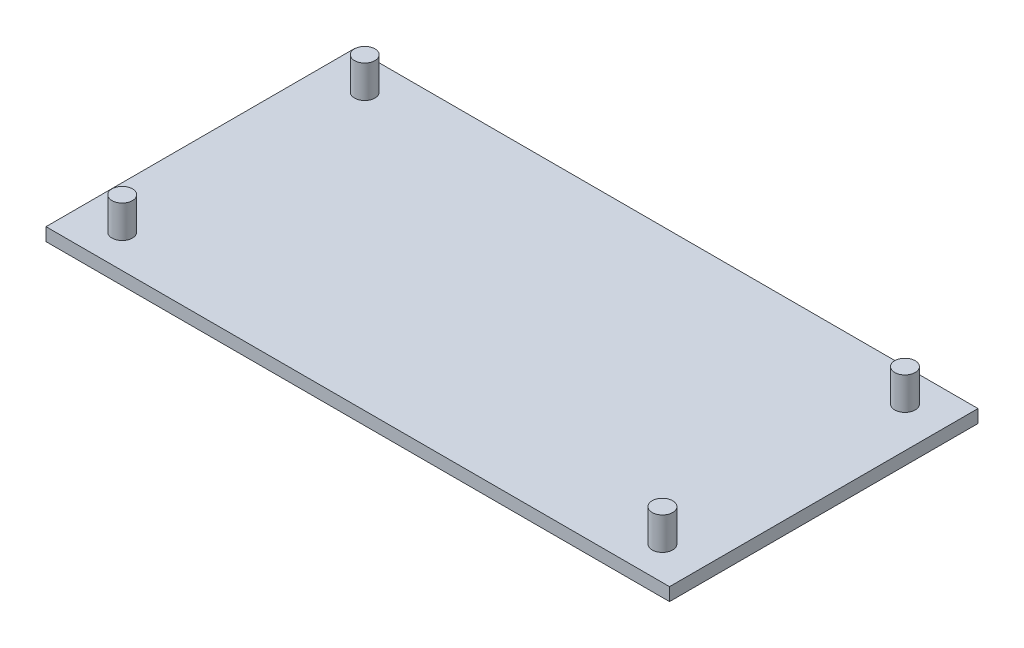
ISO-10303-21;
HEADER;
FILE_DESCRIPTION(('STEP AP214'),'2;1');
FILE_NAME('part.step','',(''),(''),'','','');
FILE_SCHEMA(('AUTOMOTIVE_DESIGN { 1 0 10303 214 1 1 1 1 }'));
ENDSEC;
DATA;
#1=APPLICATION_CONTEXT('core data for automotive mechanical design processes');
#2=APPLICATION_PROTOCOL_DEFINITION('international standard','automotive_design',2000,#1);
#3=PRODUCT_CONTEXT('',#1,'mechanical');
#4=PRODUCT('Part','Part','',(#3));
#5=PRODUCT_RELATED_PRODUCT_CATEGORY('part','',(#4));
#6=PRODUCT_DEFINITION_FORMATION('','',#4);
#7=PRODUCT_DEFINITION_CONTEXT('part definition',#1,'design');
#8=PRODUCT_DEFINITION('design','',#6,#7);
#9=PRODUCT_DEFINITION_SHAPE('','',#8);
#10=(LENGTH_UNIT() NAMED_UNIT(*) SI_UNIT(.MILLI.,.METRE.));
#11=(NAMED_UNIT(*) PLANE_ANGLE_UNIT() SI_UNIT($,.RADIAN.));
#12=(NAMED_UNIT(*) SI_UNIT($,.STERADIAN.) SOLID_ANGLE_UNIT());
#13=UNCERTAINTY_MEASURE_WITH_UNIT(LENGTH_MEASURE(1.E-05),#10,'distance_accuracy_value','');
#14=(GEOMETRIC_REPRESENTATION_CONTEXT(3) GLOBAL_UNCERTAINTY_ASSIGNED_CONTEXT((#13)) GLOBAL_UNIT_ASSIGNED_CONTEXT((#10,
#11,#12)) REPRESENTATION_CONTEXT('',''));
#15=CARTESIAN_POINT('',(0.,0.,0.));
#16=DIRECTION('',(0.,0.,1.));
#17=DIRECTION('',(1.,0.,0.));
#18=AXIS2_PLACEMENT_3D('',#15,#16,#17);
#19=CARTESIAN_POINT('',(45.8784400663104,2.,23.6626394547951));
#20=DIRECTION('',(0.,0.,1.));
#21=DIRECTION('',(1.,0.,0.));
#22=AXIS2_PLACEMENT_3D('',#19,#20,#21);
#23=PLANE('',#22);
#24=DIRECTION('',(-1.,0.,0.));
#25=VECTOR('',#24,1.);
#26=CARTESIAN_POINT('',(45.8784400663104,0.,23.6626394547951));
#27=LINE('',#26,#25);
#28=CARTESIAN_POINT('',(45.8784400663104,0.,23.6626394547951));
#29=VERTEX_POINT('',#28);
#30=CARTESIAN_POINT('',(-50.1505239347028,0.,23.6626394547951));
#31=VERTEX_POINT('',#30);
#32=EDGE_CURVE('E119',#29,#31,#27,.T.);
#33=ORIENTED_EDGE('',*,*,#32,.F.);
#34=DIRECTION('',(0.,-1.,0.));
#35=VECTOR('',#34,1.);
#36=CARTESIAN_POINT('',(45.8784400663104,2.,23.6626394547951));
#37=LINE('',#36,#35);
#38=CARTESIAN_POINT('',(45.8784400663104,2.,23.6626394547951));
#39=VERTEX_POINT('',#38);
#40=EDGE_CURVE('E62',#39,#29,#37,.T.);
#41=ORIENTED_EDGE('',*,*,#40,.F.);
#42=DIRECTION('',(-1.,0.,0.));
#43=VECTOR('',#42,1.);
#44=CARTESIAN_POINT('',(45.8784400663104,2.,23.6626394547951));
#45=LINE('',#44,#43);
#46=CARTESIAN_POINT('',(-50.1505239347028,2.,23.6626394547951));
#47=VERTEX_POINT('',#46);
#48=EDGE_CURVE('E110',#39,#47,#45,.T.);
#49=ORIENTED_EDGE('',*,*,#48,.T.);
#50=DIRECTION('',(0.,-1.,0.));
#51=VECTOR('',#50,1.);
#52=CARTESIAN_POINT('',(-50.1505239347028,2.,23.6626394547951));
#53=LINE('',#52,#51);
#54=EDGE_CURVE('E90',#47,#31,#53,.T.);
#55=ORIENTED_EDGE('',*,*,#54,.T.);
#56=EDGE_LOOP('',(#33,#41,#49,#55));
#57=FACE_BOUND('',#56,.T.);
#58=ADVANCED_FACE('F45',(#57),#23,.T.);
#59=CARTESIAN_POINT('',(45.8784400663104,2.,-23.8464269457061));
#60=DIRECTION('',(1.,0.,0.));
#61=DIRECTION('',(0.,0.,-1.));
#62=AXIS2_PLACEMENT_3D('',#59,#60,#61);
#63=PLANE('',#62);
#64=DIRECTION('',(0.,0.,1.));
#65=VECTOR('',#64,1.);
#66=CARTESIAN_POINT('',(45.8784400663104,0.,-23.8464269457061));
#67=LINE('',#66,#65);
#68=CARTESIAN_POINT('',(45.8784400663104,0.,-23.8464269457061));
#69=VERTEX_POINT('',#68);
#70=EDGE_CURVE('E113',#69,#29,#67,.T.);
#71=ORIENTED_EDGE('',*,*,#70,.F.);
#72=DIRECTION('',(0.,-1.,0.));
#73=VECTOR('',#72,1.);
#74=CARTESIAN_POINT('',(45.8784400663104,2.,-23.8464269457061));
#75=LINE('',#74,#73);
#76=CARTESIAN_POINT('',(45.8784400663104,2.,-23.8464269457061));
#77=VERTEX_POINT('',#76);
#78=EDGE_CURVE('E79',#77,#69,#75,.T.);
#79=ORIENTED_EDGE('',*,*,#78,.F.);
#80=DIRECTION('',(0.,0.,1.));
#81=VECTOR('',#80,1.);
#82=CARTESIAN_POINT('',(45.8784400663104,2.,-23.8464269457061));
#83=LINE('',#82,#81);
#84=EDGE_CURVE('E105',#77,#39,#83,.T.);
#85=ORIENTED_EDGE('',*,*,#84,.T.);
#86=ORIENTED_EDGE('',*,*,#40,.T.);
#87=EDGE_LOOP('',(#71,#79,#85,#86));
#88=FACE_BOUND('',#87,.T.);
#89=ADVANCED_FACE('F176',(#88),#63,.T.);
#90=CARTESIAN_POINT('',(-50.1505239347028,2.,-23.8464269457061));
#91=DIRECTION('',(0.,0.,-1.));
#92=DIRECTION('',(-1.,0.,0.));
#93=AXIS2_PLACEMENT_3D('',#90,#91,#92);
#94=PLANE('',#93);
#95=DIRECTION('',(1.,0.,0.));
#96=VECTOR('',#95,1.);
#97=CARTESIAN_POINT('',(-50.1505239347028,0.,-23.8464269457061));
#98=LINE('',#97,#96);
#99=CARTESIAN_POINT('',(-50.1505239347028,0.,-23.8464269457061));
#100=VERTEX_POINT('',#99);
#101=EDGE_CURVE('E98',#100,#69,#98,.T.);
#102=ORIENTED_EDGE('',*,*,#101,.F.);
#103=DIRECTION('',(0.,-1.,0.));
#104=VECTOR('',#103,1.);
#105=CARTESIAN_POINT('',(-50.1505239347028,2.,-23.8464269457061));
#106=LINE('',#105,#104);
#107=CARTESIAN_POINT('',(-50.1505239347028,2.,-23.8464269457061));
#108=VERTEX_POINT('',#107);
#109=EDGE_CURVE('E93',#108,#100,#106,.T.);
#110=ORIENTED_EDGE('',*,*,#109,.F.);
#111=DIRECTION('',(1.,0.,0.));
#112=VECTOR('',#111,1.);
#113=CARTESIAN_POINT('',(-50.1505239347028,2.,-23.8464269457061));
#114=LINE('',#113,#112);
#115=EDGE_CURVE('E96',#108,#77,#114,.T.);
#116=ORIENTED_EDGE('',*,*,#115,.T.);
#117=ORIENTED_EDGE('',*,*,#78,.T.);
#118=EDGE_LOOP('',(#102,#110,#116,#117));
#119=FACE_BOUND('',#118,.T.);
#120=ADVANCED_FACE('F95',(#119),#94,.T.);
#121=CARTESIAN_POINT('',(-50.1505239347028,2.,23.6626394547951));
#122=DIRECTION('',(-1.,0.,0.));
#123=DIRECTION('',(0.,0.,1.));
#124=AXIS2_PLACEMENT_3D('',#121,#122,#123);
#125=PLANE('',#124);
#126=DIRECTION('',(0.,0.,-1.));
#127=VECTOR('',#126,1.);
#128=CARTESIAN_POINT('',(-50.1505239347028,0.,23.6626394547951));
#129=LINE('',#128,#127);
#130=EDGE_CURVE('E123',#31,#100,#129,.T.);
#131=ORIENTED_EDGE('',*,*,#130,.F.);
#132=ORIENTED_EDGE('',*,*,#54,.F.);
#133=DIRECTION('',(0.,0.,-1.));
#134=VECTOR('',#133,1.);
#135=CARTESIAN_POINT('',(-50.1505239347028,2.,23.6626394547951));
#136=LINE('',#135,#134);
#137=EDGE_CURVE('E104',#47,#108,#136,.T.);
#138=ORIENTED_EDGE('',*,*,#137,.T.);
#139=ORIENTED_EDGE('',*,*,#109,.T.);
#140=EDGE_LOOP('',(#131,#132,#138,#139));
#141=FACE_BOUND('',#140,.T.);
#142=ADVANCED_FACE('F108',(#141),#125,.T.);
#143=CARTESIAN_POINT('',(0.,2.,0.));
#144=DIRECTION('',(0.,-1.,0.));
#145=DIRECTION('',(0.,0.,-1.));
#146=AXIS2_PLACEMENT_3D('',#143,#144,#145);
#147=PLANE('',#146);
#148=CARTESIAN_POINT('',(-43.5407817960266,2.,-18.8173236418283));
#149=DIRECTION('',(0.,-1.,0.));
#150=DIRECTION('',(0.,0.,-1.));
#151=AXIS2_PLACEMENT_3D('',#148,#149,#150);
#152=CIRCLE('',#151,1.57499999999999);
#153=CARTESIAN_POINT('',(-43.5407817960266,2.,-20.3923236418283));
#154=VERTEX_POINT('',#153);
#155=EDGE_CURVE('E11',#154,#154,#152,.F.);
#156=ORIENTED_EDGE('',*,*,#155,.F.);
#157=EDGE_LOOP('',(#156));
#158=FACE_BOUND('',#157,.T.);
#159=CARTESIAN_POINT('',(39.6592182039734,2.,18.5326763581717));
#160=DIRECTION('',(0.,-1.,0.));
#161=DIRECTION('',(0.,0.,-1.));
#162=AXIS2_PLACEMENT_3D('',#159,#160,#161);
#163=CIRCLE('',#162,1.57500000000001);
#164=CARTESIAN_POINT('',(39.6592182039734,2.,16.9576763581717));
#165=VERTEX_POINT('',#164);
#166=EDGE_CURVE('E54',#165,#165,#163,.F.);
#167=ORIENTED_EDGE('',*,*,#166,.F.);
#168=EDGE_LOOP('',(#167));
#169=FACE_BOUND('',#168,.T.);
#170=CARTESIAN_POINT('',(39.6592182039734,2.,-18.8173236418283));
#171=DIRECTION('',(0.,-1.,0.));
#172=DIRECTION('',(0.,0.,-1.));
#173=AXIS2_PLACEMENT_3D('',#170,#171,#172);
#174=CIRCLE('',#173,1.57500000000001);
#175=CARTESIAN_POINT('',(39.6592182039734,2.,-20.3923236418283));
#176=VERTEX_POINT('',#175);
#177=EDGE_CURVE('E142',#176,#176,#174,.F.);
#178=ORIENTED_EDGE('',*,*,#177,.F.);
#179=EDGE_LOOP('',(#178));
#180=FACE_BOUND('',#179,.T.);
#181=CARTESIAN_POINT('',(-43.5407817960266,2.,18.5326763581717));
#182=DIRECTION('',(0.,-1.,0.));
#183=DIRECTION('',(0.,0.,-1.));
#184=AXIS2_PLACEMENT_3D('',#181,#182,#183);
#185=CIRCLE('',#184,1.57499999999999);
#186=CARTESIAN_POINT('',(-43.5407817960266,2.,16.9576763581717));
#187=VERTEX_POINT('',#186);
#188=EDGE_CURVE('E134',#187,#187,#185,.F.);
#189=ORIENTED_EDGE('',*,*,#188,.F.);
#190=EDGE_LOOP('',(#189));
#191=FACE_BOUND('',#190,.T.);
#192=ORIENTED_EDGE('',*,*,#48,.F.);
#193=ORIENTED_EDGE('',*,*,#84,.F.);
#194=ORIENTED_EDGE('',*,*,#115,.F.);
#195=ORIENTED_EDGE('',*,*,#137,.F.);
#196=EDGE_LOOP('',(#192,#193,#194,#195));
#197=FACE_BOUND('',#196,.T.);
#198=ADVANCED_FACE('F103',(#158,#169,#180,#191,#197),#147,.F.);
#199=CARTESIAN_POINT('',(0.,0.,0.));
#200=DIRECTION('',(0.,-1.,0.));
#201=DIRECTION('',(0.,0.,-1.));
#202=AXIS2_PLACEMENT_3D('',#199,#200,#201);
#203=PLANE('',#202);
#204=ORIENTED_EDGE('',*,*,#32,.T.);
#205=ORIENTED_EDGE('',*,*,#130,.T.);
#206=ORIENTED_EDGE('',*,*,#101,.T.);
#207=ORIENTED_EDGE('',*,*,#70,.T.);
#208=EDGE_LOOP('',(#204,#205,#206,#207));
#209=FACE_BOUND('',#208,.T.);
#210=ADVANCED_FACE('F153',(#209),#203,.T.);
#211=CARTESIAN_POINT('',(-43.5407817960266,7.,18.5326763581717));
#212=DIRECTION('',(0.,-1.,0.));
#213=DIRECTION('',(0.,0.,-1.));
#214=AXIS2_PLACEMENT_3D('',#211,#212,#213);
#215=CYLINDRICAL_SURFACE('',#214,1.57499999999999);
#216=CARTESIAN_POINT('',(-43.5407817960266,7.,18.5326763581717));
#217=DIRECTION('',(0.,1.,0.));
#218=DIRECTION('',(0.,0.,1.));
#219=AXIS2_PLACEMENT_3D('',#216,#217,#218);
#220=CIRCLE('',#219,1.57499999999999);
#221=CARTESIAN_POINT('',(-43.5407817960266,7.,20.1076763581717));
#222=VERTEX_POINT('',#221);
#223=EDGE_CURVE('E124',#222,#222,#220,.T.);
#224=ORIENTED_EDGE('',*,*,#223,.F.);
#225=EDGE_LOOP('',(#224));
#226=FACE_BOUND('',#225,.T.);
#227=ORIENTED_EDGE('',*,*,#188,.T.);
#228=EDGE_LOOP('',(#227));
#229=FACE_BOUND('',#228,.T.);
#230=ADVANCED_FACE('F160',(#226,#229),#215,.T.);
#231=CARTESIAN_POINT('',(-43.5407817960266,7.,18.5326763581717));
#232=DIRECTION('',(0.,1.,0.));
#233=DIRECTION('',(0.,0.,1.));
#234=AXIS2_PLACEMENT_3D('',#231,#232,#233);
#235=PLANE('',#234);
#236=ORIENTED_EDGE('',*,*,#223,.T.);
#237=EDGE_LOOP('',(#236));
#238=FACE_BOUND('',#237,.T.);
#239=ADVANCED_FACE('F162',(#238),#235,.T.);
#240=CARTESIAN_POINT('',(39.6592182039734,7.,-18.8173236418283));
#241=DIRECTION('',(0.,-1.,0.));
#242=DIRECTION('',(0.,0.,-1.));
#243=AXIS2_PLACEMENT_3D('',#240,#241,#242);
#244=CYLINDRICAL_SURFACE('',#243,1.57500000000001);
#245=CARTESIAN_POINT('',(39.6592182039734,7.,-18.8173236418283));
#246=DIRECTION('',(0.,1.,0.));
#247=DIRECTION('',(0.,0.,1.));
#248=AXIS2_PLACEMENT_3D('',#245,#246,#247);
#249=CIRCLE('',#248,1.57500000000001);
#250=CARTESIAN_POINT('',(39.6592182039734,7.,-17.2423236418283));
#251=VERTEX_POINT('',#250);
#252=EDGE_CURVE('E285',#251,#251,#249,.T.);
#253=ORIENTED_EDGE('',*,*,#252,.F.);
#254=EDGE_LOOP('',(#253));
#255=FACE_BOUND('',#254,.T.);
#256=ORIENTED_EDGE('',*,*,#177,.T.);
#257=EDGE_LOOP('',(#256));
#258=FACE_BOUND('',#257,.T.);
#259=ADVANCED_FACE('F168',(#255,#258),#244,.T.);
#260=CARTESIAN_POINT('',(39.6592182039734,7.,-18.8173236418283));
#261=DIRECTION('',(0.,1.,0.));
#262=DIRECTION('',(0.,0.,1.));
#263=AXIS2_PLACEMENT_3D('',#260,#261,#262);
#264=PLANE('',#263);
#265=ORIENTED_EDGE('',*,*,#252,.T.);
#266=EDGE_LOOP('',(#265));
#267=FACE_BOUND('',#266,.T.);
#268=ADVANCED_FACE('F221',(#267),#264,.T.);
#269=CARTESIAN_POINT('',(39.6592182039734,7.,18.5326763581717));
#270=DIRECTION('',(0.,-1.,0.));
#271=DIRECTION('',(0.,0.,-1.));
#272=AXIS2_PLACEMENT_3D('',#269,#270,#271);
#273=CYLINDRICAL_SURFACE('',#272,1.57500000000001);
#274=CARTESIAN_POINT('',(39.6592182039734,7.,18.5326763581717));
#275=DIRECTION('',(0.,1.,0.));
#276=DIRECTION('',(0.,0.,1.));
#277=AXIS2_PLACEMENT_3D('',#274,#275,#276);
#278=CIRCLE('',#277,1.57500000000001);
#279=CARTESIAN_POINT('',(39.6592182039734,7.,20.1076763581717));
#280=VERTEX_POINT('',#279);
#281=EDGE_CURVE('E279',#280,#280,#278,.T.);
#282=ORIENTED_EDGE('',*,*,#281,.F.);
#283=EDGE_LOOP('',(#282));
#284=FACE_BOUND('',#283,.T.);
#285=ORIENTED_EDGE('',*,*,#166,.T.);
#286=EDGE_LOOP('',(#285));
#287=FACE_BOUND('',#286,.T.);
#288=ADVANCED_FACE('F149',(#284,#287),#273,.T.);
#289=CARTESIAN_POINT('',(39.6592182039734,7.,18.5326763581717));
#290=DIRECTION('',(0.,1.,0.));
#291=DIRECTION('',(0.,0.,1.));
#292=AXIS2_PLACEMENT_3D('',#289,#290,#291);
#293=PLANE('',#292);
#294=ORIENTED_EDGE('',*,*,#281,.T.);
#295=EDGE_LOOP('',(#294));
#296=FACE_BOUND('',#295,.T.);
#297=ADVANCED_FACE('F238',(#296),#293,.T.);
#298=CARTESIAN_POINT('',(-43.5407817960266,7.,-18.8173236418283));
#299=DIRECTION('',(0.,-1.,0.));
#300=DIRECTION('',(0.,0.,-1.));
#301=AXIS2_PLACEMENT_3D('',#298,#299,#300);
#302=CYLINDRICAL_SURFACE('',#301,1.57499999999999);
#303=CARTESIAN_POINT('',(-43.5407817960266,7.,-18.8173236418283));
#304=DIRECTION('',(0.,1.,0.));
#305=DIRECTION('',(0.,0.,1.));
#306=AXIS2_PLACEMENT_3D('',#303,#304,#305);
#307=CIRCLE('',#306,1.57499999999999);
#308=CARTESIAN_POINT('',(-43.5407817960266,7.,-17.2423236418283));
#309=VERTEX_POINT('',#308);
#310=EDGE_CURVE('E277',#309,#309,#307,.T.);
#311=ORIENTED_EDGE('',*,*,#310,.F.);
#312=EDGE_LOOP('',(#311));
#313=FACE_BOUND('',#312,.T.);
#314=ORIENTED_EDGE('',*,*,#155,.T.);
#315=EDGE_LOOP('',(#314));
#316=FACE_BOUND('',#315,.T.);
#317=ADVANCED_FACE('F247',(#313,#316),#302,.T.);
#318=CARTESIAN_POINT('',(-43.5407817960266,7.,-18.8173236418283));
#319=DIRECTION('',(0.,1.,0.));
#320=DIRECTION('',(0.,0.,1.));
#321=AXIS2_PLACEMENT_3D('',#318,#319,#320);
#322=PLANE('',#321);
#323=ORIENTED_EDGE('',*,*,#310,.T.);
#324=EDGE_LOOP('',(#323));
#325=FACE_BOUND('',#324,.T.);
#326=ADVANCED_FACE('F256',(#325),#322,.T.);
#327=CLOSED_SHELL('',(#58,#89,#120,#142,#198,#210,#230,#239,#259,#268,#288,#297,#317,#326));
#328=MANIFOLD_SOLID_BREP('B2',#327);
#329=ADVANCED_BREP_SHAPE_REPRESENTATION('',(#18,#328),#14);
#330=SHAPE_DEFINITION_REPRESENTATION(#9,#329);
ENDSEC;
END-ISO-10303-21;
